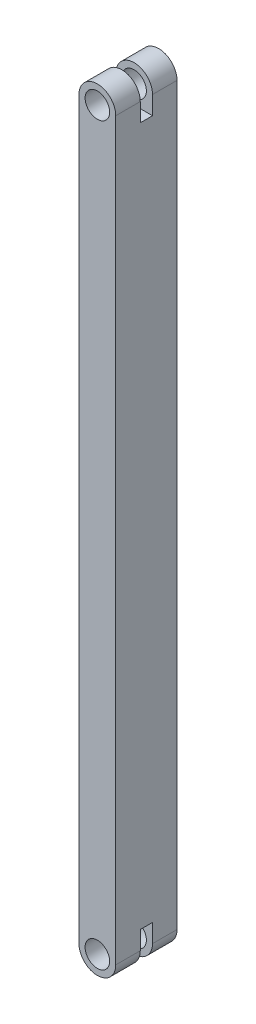
ISO-10303-21;
HEADER;
FILE_DESCRIPTION(('STEP AP214'),'2;1');
FILE_NAME('part.step','',(''),(''),'','','');
FILE_SCHEMA(('AUTOMOTIVE_DESIGN { 1 0 10303 214 1 1 1 1 }'));
ENDSEC;
DATA;
#1=APPLICATION_CONTEXT('core data for automotive mechanical design processes');
#2=APPLICATION_PROTOCOL_DEFINITION('international standard','automotive_design',2000,#1);
#3=PRODUCT_CONTEXT('',#1,'mechanical');
#4=PRODUCT('Part','Part','',(#3));
#5=PRODUCT_RELATED_PRODUCT_CATEGORY('part','',(#4));
#6=PRODUCT_DEFINITION_FORMATION('','',#4);
#7=PRODUCT_DEFINITION_CONTEXT('part definition',#1,'design');
#8=PRODUCT_DEFINITION('design','',#6,#7);
#9=PRODUCT_DEFINITION_SHAPE('','',#8);
#10=(LENGTH_UNIT() NAMED_UNIT(*) SI_UNIT(.MILLI.,.METRE.));
#11=(NAMED_UNIT(*) PLANE_ANGLE_UNIT() SI_UNIT($,.RADIAN.));
#12=(NAMED_UNIT(*) SI_UNIT($,.STERADIAN.) SOLID_ANGLE_UNIT());
#13=UNCERTAINTY_MEASURE_WITH_UNIT(LENGTH_MEASURE(1.E-05),#10,'distance_accuracy_value','');
#14=(GEOMETRIC_REPRESENTATION_CONTEXT(3) GLOBAL_UNCERTAINTY_ASSIGNED_CONTEXT((#13)) GLOBAL_UNIT_ASSIGNED_CONTEXT((#10,
#11,#12)) REPRESENTATION_CONTEXT('',''));
#15=CARTESIAN_POINT('',(0.,0.,0.));
#16=DIRECTION('',(0.,0.,1.));
#17=DIRECTION('',(1.,0.,0.));
#18=AXIS2_PLACEMENT_3D('',#15,#16,#17);
#19=CARTESIAN_POINT('',(0.,0.,25.));
#20=DIRECTION('',(0.,0.,-1.));
#21=DIRECTION('',(-1.,0.,0.));
#22=AXIS2_PLACEMENT_3D('',#19,#20,#21);
#23=CYLINDRICAL_SURFACE('',#22,7.5);
#24=DIRECTION('',(0.,0.,-1.));
#25=VECTOR('',#24,1.);
#26=CARTESIAN_POINT('',(7.5,0.,25.));
#27=LINE('',#26,#25);
#28=CARTESIAN_POINT('',(7.5,0.,9.99999999999997));
#29=VERTEX_POINT('',#28);
#30=CARTESIAN_POINT('',(7.5,0.,0.));
#31=VERTEX_POINT('',#30);
#32=EDGE_CURVE('E173',#29,#31,#27,.T.);
#33=ORIENTED_EDGE('',*,*,#32,.F.);
#34=CARTESIAN_POINT('',(0.,0.,9.99999999999997));
#35=DIRECTION('',(0.,0.,-1.));
#36=DIRECTION('',(-1.,0.,0.));
#37=AXIS2_PLACEMENT_3D('',#34,#35,#36);
#38=CIRCLE('',#37,7.5);
#39=CARTESIAN_POINT('',(-7.5,0.,9.99999999999997));
#40=VERTEX_POINT('',#39);
#41=EDGE_CURVE('E225',#29,#40,#38,.T.);
#42=ORIENTED_EDGE('',*,*,#41,.T.);
#43=DIRECTION('',(0.,0.,-1.));
#44=VECTOR('',#43,1.);
#45=CARTESIAN_POINT('',(-7.5,0.,25.));
#46=LINE('',#45,#44);
#47=CARTESIAN_POINT('',(-7.5,0.,0.));
#48=VERTEX_POINT('',#47);
#49=EDGE_CURVE('E273',#40,#48,#46,.T.);
#50=ORIENTED_EDGE('',*,*,#49,.T.);
#51=CARTESIAN_POINT('',(0.,0.,0.));
#52=DIRECTION('',(0.,0.,1.));
#53=DIRECTION('',(1.,0.,0.));
#54=AXIS2_PLACEMENT_3D('',#51,#52,#53);
#55=CIRCLE('',#54,7.5);
#56=EDGE_CURVE('E259',#48,#31,#55,.T.);
#57=ORIENTED_EDGE('',*,*,#56,.T.);
#58=EDGE_LOOP('',(#33,#42,#50,#57));
#59=FACE_BOUND('',#58,.T.);
#60=ADVANCED_FACE('F39',(#59),#23,.T.);
#61=CARTESIAN_POINT('',(0.,300.,25.));
#62=DIRECTION('',(0.,0.,-1.));
#63=DIRECTION('',(-1.,0.,0.));
#64=AXIS2_PLACEMENT_3D('',#61,#62,#63);
#65=CYLINDRICAL_SURFACE('',#64,7.5);
#66=DIRECTION('',(0.,0.,-1.));
#67=VECTOR('',#66,1.);
#68=CARTESIAN_POINT('',(7.5,300.,25.));
#69=LINE('',#68,#67);
#70=CARTESIAN_POINT('',(7.5,300.,25.));
#71=VERTEX_POINT('',#70);
#72=CARTESIAN_POINT('',(7.5,300.,15.));
#73=VERTEX_POINT('',#72);
#74=EDGE_CURVE('E165',#71,#73,#69,.T.);
#75=ORIENTED_EDGE('',*,*,#74,.T.);
#76=CARTESIAN_POINT('',(0.,300.,15.));
#77=DIRECTION('',(0.,0.,1.));
#78=DIRECTION('',(0.,-1.,0.));
#79=AXIS2_PLACEMENT_3D('',#76,#77,#78);
#80=CIRCLE('',#79,7.5);
#81=CARTESIAN_POINT('',(-7.5,300.,15.));
#82=VERTEX_POINT('',#81);
#83=EDGE_CURVE('E256',#73,#82,#80,.T.);
#84=ORIENTED_EDGE('',*,*,#83,.T.);
#85=DIRECTION('',(0.,0.,-1.));
#86=VECTOR('',#85,1.);
#87=CARTESIAN_POINT('',(-7.5,300.,25.));
#88=LINE('',#87,#86);
#89=CARTESIAN_POINT('',(-7.5,300.,25.));
#90=VERTEX_POINT('',#89);
#91=EDGE_CURVE('E154',#90,#82,#88,.T.);
#92=ORIENTED_EDGE('',*,*,#91,.F.);
#93=CARTESIAN_POINT('',(0.,300.,25.));
#94=DIRECTION('',(0.,0.,1.));
#95=DIRECTION('',(1.,0.,0.));
#96=AXIS2_PLACEMENT_3D('',#93,#94,#95);
#97=CIRCLE('',#96,7.5);
#98=EDGE_CURVE('E268',#71,#90,#97,.T.);
#99=ORIENTED_EDGE('',*,*,#98,.F.);
#100=EDGE_LOOP('',(#75,#84,#92,#99));
#101=FACE_BOUND('',#100,.T.);
#102=ADVANCED_FACE('F313',(#101),#65,.T.);
#103=CARTESIAN_POINT('',(-7.5,0.,25.));
#104=VERTEX_POINT('',#103);
#105=CARTESIAN_POINT('',(-7.5,0.,15.));
#106=VERTEX_POINT('',#105);
#107=EDGE_CURVE('E167',#104,#106,#46,.T.);
#108=ORIENTED_EDGE('',*,*,#107,.T.);
#109=CARTESIAN_POINT('',(0.,0.,15.));
#110=DIRECTION('',(0.,0.,1.));
#111=DIRECTION('',(1.,0.,0.));
#112=AXIS2_PLACEMENT_3D('',#109,#110,#111);
#113=CIRCLE('',#112,7.5);
#114=CARTESIAN_POINT('',(7.5,0.,15.));
#115=VERTEX_POINT('',#114);
#116=EDGE_CURVE('E250',#106,#115,#113,.T.);
#117=ORIENTED_EDGE('',*,*,#116,.T.);
#118=CARTESIAN_POINT('',(7.5,0.,25.));
#119=VERTEX_POINT('',#118);
#120=EDGE_CURVE('E174',#119,#115,#27,.T.);
#121=ORIENTED_EDGE('',*,*,#120,.F.);
#122=CARTESIAN_POINT('',(0.,0.,25.));
#123=DIRECTION('',(0.,0.,1.));
#124=DIRECTION('',(1.,0.,0.));
#125=AXIS2_PLACEMENT_3D('',#122,#123,#124);
#126=CIRCLE('',#125,7.5);
#127=EDGE_CURVE('E260',#104,#119,#126,.T.);
#128=ORIENTED_EDGE('',*,*,#127,.F.);
#129=EDGE_LOOP('',(#108,#117,#121,#128));
#130=FACE_BOUND('',#129,.T.);
#131=ADVANCED_FACE('F41',(#130),#23,.T.);
#132=CARTESIAN_POINT('',(7.5,0.,25.));
#133=DIRECTION('',(-1.,0.,0.));
#134=DIRECTION('',(0.,0.,1.));
#135=AXIS2_PLACEMENT_3D('',#132,#133,#134);
#136=PLANE('',#135);
#137=DIRECTION('',(0.,0.,-1.));
#138=VECTOR('',#137,1.);
#139=CARTESIAN_POINT('',(7.5,292.5,15.));
#140=LINE('',#139,#138);
#141=CARTESIAN_POINT('',(7.5,292.5,15.));
#142=VERTEX_POINT('',#141);
#143=CARTESIAN_POINT('',(7.5,292.5,10.));
#144=VERTEX_POINT('',#143);
#145=EDGE_CURVE('E217',#142,#144,#140,.T.);
#146=ORIENTED_EDGE('',*,*,#145,.F.);
#147=DIRECTION('',(0.,-1.,0.));
#148=VECTOR('',#147,1.);
#149=CARTESIAN_POINT('',(7.5,307.5,15.));
#150=LINE('',#149,#148);
#151=EDGE_CURVE('E137',#73,#142,#150,.T.);
#152=ORIENTED_EDGE('',*,*,#151,.F.);
#153=ORIENTED_EDGE('',*,*,#74,.F.);
#154=DIRECTION('',(0.,1.,0.));
#155=VECTOR('',#154,1.);
#156=CARTESIAN_POINT('',(7.5,0.,25.));
#157=LINE('',#156,#155);
#158=EDGE_CURVE('E264',#119,#71,#157,.T.);
#159=ORIENTED_EDGE('',*,*,#158,.F.);
#160=ORIENTED_EDGE('',*,*,#120,.T.);
#161=DIRECTION('',(0.,-1.,0.));
#162=VECTOR('',#161,1.);
#163=CARTESIAN_POINT('',(7.5,-7.5,15.));
#164=LINE('',#163,#162);
#165=CARTESIAN_POINT('',(7.5,7.5,15.));
#166=VERTEX_POINT('',#165);
#167=EDGE_CURVE('E211',#166,#115,#164,.T.);
#168=ORIENTED_EDGE('',*,*,#167,.F.);
#169=DIRECTION('',(0.,0.,1.));
#170=VECTOR('',#169,1.);
#171=CARTESIAN_POINT('',(7.5,7.5,15.));
#172=LINE('',#171,#170);
#173=CARTESIAN_POINT('',(7.5,7.5,9.99999999999997));
#174=VERTEX_POINT('',#173);
#175=EDGE_CURVE('E231',#174,#166,#172,.T.);
#176=ORIENTED_EDGE('',*,*,#175,.F.);
#177=DIRECTION('',(0.,1.,0.));
#178=VECTOR('',#177,1.);
#179=CARTESIAN_POINT('',(7.5,-7.5,9.99999999999997));
#180=LINE('',#179,#178);
#181=EDGE_CURVE('E238',#29,#174,#180,.T.);
#182=ORIENTED_EDGE('',*,*,#181,.F.);
#183=ORIENTED_EDGE('',*,*,#32,.T.);
#184=DIRECTION('',(0.,1.,0.));
#185=VECTOR('',#184,1.);
#186=CARTESIAN_POINT('',(7.5,0.,0.));
#187=LINE('',#186,#185);
#188=CARTESIAN_POINT('',(7.5,300.,0.));
#189=VERTEX_POINT('',#188);
#190=EDGE_CURVE('E277',#31,#189,#187,.T.);
#191=ORIENTED_EDGE('',*,*,#190,.T.);
#192=CARTESIAN_POINT('',(7.5,300.,10.));
#193=VERTEX_POINT('',#192);
#194=EDGE_CURVE('E160',#193,#189,#69,.T.);
#195=ORIENTED_EDGE('',*,*,#194,.F.);
#196=DIRECTION('',(0.,1.,0.));
#197=VECTOR('',#196,1.);
#198=CARTESIAN_POINT('',(7.5,307.5,10.));
#199=LINE('',#198,#197);
#200=EDGE_CURVE('E149',#144,#193,#199,.T.);
#201=ORIENTED_EDGE('',*,*,#200,.F.);
#202=EDGE_LOOP('',(#146,#152,#153,#159,#160,#168,#176,#182,#183,#191,#195,#201));
#203=FACE_BOUND('',#202,.T.);
#204=ADVANCED_FACE('F309',(#203),#136,.F.);
#205=CARTESIAN_POINT('',(0.,300.,10.));
#206=DIRECTION('',(0.,0.,-1.));
#207=DIRECTION('',(0.,1.,0.));
#208=AXIS2_PLACEMENT_3D('',#205,#206,#207);
#209=CIRCLE('',#208,7.5);
#210=CARTESIAN_POINT('',(-7.5,300.,10.));
#211=VERTEX_POINT('',#210);
#212=EDGE_CURVE('E253',#211,#193,#209,.T.);
#213=ORIENTED_EDGE('',*,*,#212,.T.);
#214=ORIENTED_EDGE('',*,*,#194,.T.);
#215=CARTESIAN_POINT('',(0.,300.,0.));
#216=DIRECTION('',(0.,0.,1.));
#217=DIRECTION('',(1.,0.,0.));
#218=AXIS2_PLACEMENT_3D('',#215,#216,#217);
#219=CIRCLE('',#218,7.5);
#220=CARTESIAN_POINT('',(-7.5,300.,0.));
#221=VERTEX_POINT('',#220);
#222=EDGE_CURVE('E281',#189,#221,#219,.T.);
#223=ORIENTED_EDGE('',*,*,#222,.T.);
#224=EDGE_CURVE('E161',#211,#221,#88,.T.);
#225=ORIENTED_EDGE('',*,*,#224,.F.);
#226=EDGE_LOOP('',(#213,#214,#223,#225));
#227=FACE_BOUND('',#226,.T.);
#228=ADVANCED_FACE('F318',(#227),#65,.T.);
#229=CARTESIAN_POINT('',(-7.5,0.,25.));
#230=DIRECTION('',(1.,0.,0.));
#231=DIRECTION('',(0.,0.,-1.));
#232=AXIS2_PLACEMENT_3D('',#229,#230,#231);
#233=PLANE('',#232);
#234=ORIENTED_EDGE('',*,*,#91,.T.);
#235=DIRECTION('',(0.,-1.,0.));
#236=VECTOR('',#235,1.);
#237=CARTESIAN_POINT('',(-7.5,0.,15.));
#238=LINE('',#237,#236);
#239=CARTESIAN_POINT('',(-7.5,292.5,15.));
#240=VERTEX_POINT('',#239);
#241=EDGE_CURVE('E11',#82,#240,#238,.T.);
#242=ORIENTED_EDGE('',*,*,#241,.T.);
#243=DIRECTION('',(0.,0.,-1.));
#244=VECTOR('',#243,1.);
#245=CARTESIAN_POINT('',(-7.5,292.5,15.));
#246=LINE('',#245,#244);
#247=CARTESIAN_POINT('',(-7.5,292.5,10.));
#248=VERTEX_POINT('',#247);
#249=EDGE_CURVE('E145',#240,#248,#246,.T.);
#250=ORIENTED_EDGE('',*,*,#249,.T.);
#251=DIRECTION('',(0.,1.,0.));
#252=VECTOR('',#251,1.);
#253=CARTESIAN_POINT('',(-7.5,307.5,10.));
#254=LINE('',#253,#252);
#255=EDGE_CURVE('E57',#248,#211,#254,.T.);
#256=ORIENTED_EDGE('',*,*,#255,.T.);
#257=ORIENTED_EDGE('',*,*,#224,.T.);
#258=DIRECTION('',(0.,-1.,0.));
#259=VECTOR('',#258,1.);
#260=CARTESIAN_POINT('',(-7.5,0.,0.));
#261=LINE('',#260,#259);
#262=EDGE_CURVE('E265',#221,#48,#261,.T.);
#263=ORIENTED_EDGE('',*,*,#262,.T.);
#264=ORIENTED_EDGE('',*,*,#49,.F.);
#265=DIRECTION('',(0.,1.,0.));
#266=VECTOR('',#265,1.);
#267=CARTESIAN_POINT('',(-7.5,0.,9.99999999999997));
#268=LINE('',#267,#266);
#269=CARTESIAN_POINT('',(-7.5,7.5,9.99999999999997));
#270=VERTEX_POINT('',#269);
#271=EDGE_CURVE('E49',#40,#270,#268,.T.);
#272=ORIENTED_EDGE('',*,*,#271,.T.);
#273=DIRECTION('',(0.,0.,1.));
#274=VECTOR('',#273,1.);
#275=CARTESIAN_POINT('',(-7.5,7.5,15.));
#276=LINE('',#275,#274);
#277=CARTESIAN_POINT('',(-7.5,7.5,15.));
#278=VERTEX_POINT('',#277);
#279=EDGE_CURVE('E65',#270,#278,#276,.T.);
#280=ORIENTED_EDGE('',*,*,#279,.T.);
#281=DIRECTION('',(0.,-1.,0.));
#282=VECTOR('',#281,1.);
#283=CARTESIAN_POINT('',(-7.5,-7.5,15.));
#284=LINE('',#283,#282);
#285=EDGE_CURVE('E227',#278,#106,#284,.T.);
#286=ORIENTED_EDGE('',*,*,#285,.T.);
#287=ORIENTED_EDGE('',*,*,#107,.F.);
#288=DIRECTION('',(0.,-1.,0.));
#289=VECTOR('',#288,1.);
#290=CARTESIAN_POINT('',(-7.5,0.,25.));
#291=LINE('',#290,#289);
#292=EDGE_CURVE('E156',#90,#104,#291,.T.);
#293=ORIENTED_EDGE('',*,*,#292,.F.);
#294=EDGE_LOOP('',(#234,#242,#250,#256,#257,#263,#264,#272,#280,#286,#287,#293));
#295=FACE_BOUND('',#294,.T.);
#296=ADVANCED_FACE('F151',(#295),#233,.F.);
#297=CARTESIAN_POINT('',(0.,0.,25.));
#298=DIRECTION('',(0.,0.,1.));
#299=DIRECTION('',(1.,0.,0.));
#300=AXIS2_PLACEMENT_3D('',#297,#298,#299);
#301=PLANE('',#300);
#302=CARTESIAN_POINT('',(0.,300.,25.));
#303=DIRECTION('',(0.,0.,1.));
#304=DIRECTION('',(1.,0.,0.));
#305=AXIS2_PLACEMENT_3D('',#302,#303,#304);
#306=CIRCLE('',#305,5.);
#307=CARTESIAN_POINT('',(5.,300.,25.));
#308=VERTEX_POINT('',#307);
#309=EDGE_CURVE('E192',#308,#308,#306,.T.);
#310=ORIENTED_EDGE('',*,*,#309,.F.);
#311=EDGE_LOOP('',(#310));
#312=FACE_BOUND('',#311,.T.);
#313=CARTESIAN_POINT('',(0.,0.,25.));
#314=DIRECTION('',(0.,0.,1.));
#315=DIRECTION('',(1.,0.,0.));
#316=AXIS2_PLACEMENT_3D('',#313,#314,#315);
#317=CIRCLE('',#316,5.);
#318=CARTESIAN_POINT('',(5.,0.,25.));
#319=VERTEX_POINT('',#318);
#320=EDGE_CURVE('E204',#319,#319,#317,.T.);
#321=ORIENTED_EDGE('',*,*,#320,.F.);
#322=EDGE_LOOP('',(#321));
#323=FACE_BOUND('',#322,.T.);
#324=ORIENTED_EDGE('',*,*,#127,.T.);
#325=ORIENTED_EDGE('',*,*,#158,.T.);
#326=ORIENTED_EDGE('',*,*,#98,.T.);
#327=ORIENTED_EDGE('',*,*,#292,.T.);
#328=EDGE_LOOP('',(#324,#325,#326,#327));
#329=FACE_BOUND('',#328,.T.);
#330=ADVANCED_FACE('F312',(#312,#323,#329),#301,.T.);
#331=CARTESIAN_POINT('',(0.,0.,0.));
#332=DIRECTION('',(0.,0.,1.));
#333=DIRECTION('',(1.,0.,0.));
#334=AXIS2_PLACEMENT_3D('',#331,#332,#333);
#335=PLANE('',#334);
#336=CARTESIAN_POINT('',(0.,300.,0.));
#337=DIRECTION('',(0.,0.,1.));
#338=DIRECTION('',(1.,0.,0.));
#339=AXIS2_PLACEMENT_3D('',#336,#337,#338);
#340=CIRCLE('',#339,5.);
#341=CARTESIAN_POINT('',(5.,300.,0.));
#342=VERTEX_POINT('',#341);
#343=EDGE_CURVE('E184',#342,#342,#340,.T.);
#344=ORIENTED_EDGE('',*,*,#343,.T.);
#345=EDGE_LOOP('',(#344));
#346=FACE_BOUND('',#345,.T.);
#347=CARTESIAN_POINT('',(0.,0.,0.));
#348=DIRECTION('',(0.,0.,1.));
#349=DIRECTION('',(1.,0.,0.));
#350=AXIS2_PLACEMENT_3D('',#347,#348,#349);
#351=CIRCLE('',#350,5.);
#352=CARTESIAN_POINT('',(5.,0.,0.));
#353=VERTEX_POINT('',#352);
#354=EDGE_CURVE('E198',#353,#353,#351,.T.);
#355=ORIENTED_EDGE('',*,*,#354,.T.);
#356=EDGE_LOOP('',(#355));
#357=FACE_BOUND('',#356,.T.);
#358=ORIENTED_EDGE('',*,*,#56,.F.);
#359=ORIENTED_EDGE('',*,*,#262,.F.);
#360=ORIENTED_EDGE('',*,*,#222,.F.);
#361=ORIENTED_EDGE('',*,*,#190,.F.);
#362=EDGE_LOOP('',(#358,#359,#360,#361));
#363=FACE_BOUND('',#362,.T.);
#364=ADVANCED_FACE('F293',(#346,#357,#363),#335,.F.);
#365=CARTESIAN_POINT('',(-7.5,-7.5,15.));
#366=DIRECTION('',(0.,0.,1.));
#367=DIRECTION('',(1.,0.,0.));
#368=AXIS2_PLACEMENT_3D('',#365,#366,#367);
#369=PLANE('',#368);
#370=CARTESIAN_POINT('',(0.,0.,15.));
#371=DIRECTION('',(0.,0.,1.));
#372=DIRECTION('',(1.,0.,0.));
#373=AXIS2_PLACEMENT_3D('',#370,#371,#372);
#374=CIRCLE('',#373,5.);
#375=CARTESIAN_POINT('',(5.,0.,15.));
#376=VERTEX_POINT('',#375);
#377=EDGE_CURVE('E208',#376,#376,#374,.T.);
#378=ORIENTED_EDGE('',*,*,#377,.T.);
#379=EDGE_LOOP('',(#378));
#380=FACE_BOUND('',#379,.T.);
#381=ORIENTED_EDGE('',*,*,#285,.F.);
#382=DIRECTION('',(1.,0.,0.));
#383=VECTOR('',#382,1.);
#384=CARTESIAN_POINT('',(-7.5,7.5,15.));
#385=LINE('',#384,#383);
#386=EDGE_CURVE('E218',#278,#166,#385,.T.);
#387=ORIENTED_EDGE('',*,*,#386,.T.);
#388=ORIENTED_EDGE('',*,*,#167,.T.);
#389=ORIENTED_EDGE('',*,*,#116,.F.);
#390=EDGE_LOOP('',(#381,#387,#388,#389));
#391=FACE_BOUND('',#390,.T.);
#392=ADVANCED_FACE('F305',(#380,#391),#369,.F.);
#393=CARTESIAN_POINT('',(-7.5,-7.5,9.99999999999997));
#394=DIRECTION('',(0.,0.,-1.));
#395=DIRECTION('',(-1.,0.,0.));
#396=AXIS2_PLACEMENT_3D('',#393,#394,#395);
#397=PLANE('',#396);
#398=CARTESIAN_POINT('',(0.,0.,9.99999999999997));
#399=DIRECTION('',(0.,0.,-1.));
#400=DIRECTION('',(-1.,0.,0.));
#401=AXIS2_PLACEMENT_3D('',#398,#399,#400);
#402=CIRCLE('',#401,5.);
#403=CARTESIAN_POINT('',(-5.,0.,9.99999999999997));
#404=VERTEX_POINT('',#403);
#405=EDGE_CURVE('E43',#404,#404,#402,.T.);
#406=ORIENTED_EDGE('',*,*,#405,.T.);
#407=EDGE_LOOP('',(#406));
#408=FACE_BOUND('',#407,.T.);
#409=ORIENTED_EDGE('',*,*,#181,.T.);
#410=DIRECTION('',(1.,0.,0.));
#411=VECTOR('',#410,1.);
#412=CARTESIAN_POINT('',(-7.5,7.5,9.99999999999997));
#413=LINE('',#412,#411);
#414=EDGE_CURVE('E234',#270,#174,#413,.T.);
#415=ORIENTED_EDGE('',*,*,#414,.F.);
#416=ORIENTED_EDGE('',*,*,#271,.F.);
#417=ORIENTED_EDGE('',*,*,#41,.F.);
#418=EDGE_LOOP('',(#409,#415,#416,#417));
#419=FACE_BOUND('',#418,.T.);
#420=ADVANCED_FACE('F322',(#408,#419),#397,.F.);
#421=CARTESIAN_POINT('',(-7.5,7.5,15.));
#422=DIRECTION('',(0.,1.,0.));
#423=DIRECTION('',(0.,0.,1.));
#424=AXIS2_PLACEMENT_3D('',#421,#422,#423);
#425=PLANE('',#424);
#426=ORIENTED_EDGE('',*,*,#175,.T.);
#427=ORIENTED_EDGE('',*,*,#386,.F.);
#428=ORIENTED_EDGE('',*,*,#279,.F.);
#429=ORIENTED_EDGE('',*,*,#414,.T.);
#430=EDGE_LOOP('',(#426,#427,#428,#429));
#431=FACE_BOUND('',#430,.T.);
#432=ADVANCED_FACE('F323',(#431),#425,.F.);
#433=CARTESIAN_POINT('',(-7.5,307.5,15.));
#434=DIRECTION('',(0.,0.,1.));
#435=DIRECTION('',(0.,-1.,0.));
#436=AXIS2_PLACEMENT_3D('',#433,#434,#435);
#437=PLANE('',#436);
#438=CARTESIAN_POINT('',(0.,300.,15.));
#439=DIRECTION('',(0.,0.,1.));
#440=DIRECTION('',(0.,-1.,0.));
#441=AXIS2_PLACEMENT_3D('',#438,#439,#440);
#442=CIRCLE('',#441,5.);
#443=CARTESIAN_POINT('',(0.,295.,15.));
#444=VERTEX_POINT('',#443);
#445=EDGE_CURVE('E183',#444,#444,#442,.T.);
#446=ORIENTED_EDGE('',*,*,#445,.T.);
#447=EDGE_LOOP('',(#446));
#448=FACE_BOUND('',#447,.T.);
#449=ORIENTED_EDGE('',*,*,#151,.T.);
#450=DIRECTION('',(1.,0.,0.));
#451=VECTOR('',#450,1.);
#452=CARTESIAN_POINT('',(-7.5,292.5,15.));
#453=LINE('',#452,#451);
#454=EDGE_CURVE('E132',#240,#142,#453,.T.);
#455=ORIENTED_EDGE('',*,*,#454,.F.);
#456=ORIENTED_EDGE('',*,*,#241,.F.);
#457=ORIENTED_EDGE('',*,*,#83,.F.);
#458=EDGE_LOOP('',(#449,#455,#456,#457));
#459=FACE_BOUND('',#458,.T.);
#460=ADVANCED_FACE('F134',(#448,#459),#437,.F.);
#461=CARTESIAN_POINT('',(-7.5,307.5,10.));
#462=DIRECTION('',(0.,0.,-1.));
#463=DIRECTION('',(0.,1.,0.));
#464=AXIS2_PLACEMENT_3D('',#461,#462,#463);
#465=PLANE('',#464);
#466=CARTESIAN_POINT('',(0.,300.,10.));
#467=DIRECTION('',(0.,0.,-1.));
#468=DIRECTION('',(0.,1.,0.));
#469=AXIS2_PLACEMENT_3D('',#466,#467,#468);
#470=CIRCLE('',#469,5.);
#471=CARTESIAN_POINT('',(0.,305.,10.));
#472=VERTEX_POINT('',#471);
#473=EDGE_CURVE('E180',#472,#472,#470,.T.);
#474=ORIENTED_EDGE('',*,*,#473,.T.);
#475=EDGE_LOOP('',(#474));
#476=FACE_BOUND('',#475,.T.);
#477=ORIENTED_EDGE('',*,*,#212,.F.);
#478=ORIENTED_EDGE('',*,*,#255,.F.);
#479=DIRECTION('',(1.,0.,0.));
#480=VECTOR('',#479,1.);
#481=CARTESIAN_POINT('',(-7.5,292.5,10.));
#482=LINE('',#481,#480);
#483=EDGE_CURVE('E142',#248,#144,#482,.T.);
#484=ORIENTED_EDGE('',*,*,#483,.T.);
#485=ORIENTED_EDGE('',*,*,#200,.T.);
#486=EDGE_LOOP('',(#477,#478,#484,#485));
#487=FACE_BOUND('',#486,.T.);
#488=ADVANCED_FACE('F316',(#476,#487),#465,.F.);
#489=CARTESIAN_POINT('',(-7.5,292.5,15.));
#490=DIRECTION('',(0.,-1.,0.));
#491=DIRECTION('',(0.,0.,-1.));
#492=AXIS2_PLACEMENT_3D('',#489,#490,#491);
#493=PLANE('',#492);
#494=ORIENTED_EDGE('',*,*,#145,.T.);
#495=ORIENTED_EDGE('',*,*,#483,.F.);
#496=ORIENTED_EDGE('',*,*,#249,.F.);
#497=ORIENTED_EDGE('',*,*,#454,.T.);
#498=EDGE_LOOP('',(#494,#495,#496,#497));
#499=FACE_BOUND('',#498,.T.);
#500=ADVANCED_FACE('F146',(#499),#493,.F.);
#501=CARTESIAN_POINT('',(0.,300.,0.));
#502=DIRECTION('',(0.,0.,1.));
#503=DIRECTION('',(1.,0.,0.));
#504=AXIS2_PLACEMENT_3D('',#501,#502,#503);
#505=CYLINDRICAL_SURFACE('',#504,5.);
#506=ORIENTED_EDGE('',*,*,#343,.F.);
#507=EDGE_LOOP('',(#506));
#508=FACE_BOUND('',#507,.T.);
#509=ORIENTED_EDGE('',*,*,#473,.F.);
#510=EDGE_LOOP('',(#509));
#511=FACE_BOUND('',#510,.T.);
#512=ADVANCED_FACE('F375',(#508,#511),#505,.F.);
#513=ORIENTED_EDGE('',*,*,#309,.T.);
#514=EDGE_LOOP('',(#513));
#515=FACE_BOUND('',#514,.T.);
#516=ORIENTED_EDGE('',*,*,#445,.F.);
#517=EDGE_LOOP('',(#516));
#518=FACE_BOUND('',#517,.T.);
#519=ADVANCED_FACE('F368',(#515,#518),#505,.F.);
#520=CARTESIAN_POINT('',(0.,0.,0.));
#521=DIRECTION('',(0.,0.,1.));
#522=DIRECTION('',(1.,0.,0.));
#523=AXIS2_PLACEMENT_3D('',#520,#521,#522);
#524=CYLINDRICAL_SURFACE('',#523,5.);
#525=ORIENTED_EDGE('',*,*,#354,.F.);
#526=EDGE_LOOP('',(#525));
#527=FACE_BOUND('',#526,.T.);
#528=ORIENTED_EDGE('',*,*,#405,.F.);
#529=EDGE_LOOP('',(#528));
#530=FACE_BOUND('',#529,.T.);
#531=ADVANCED_FACE('F362',(#527,#530),#524,.F.);
#532=ORIENTED_EDGE('',*,*,#320,.T.);
#533=EDGE_LOOP('',(#532));
#534=FACE_BOUND('',#533,.T.);
#535=ORIENTED_EDGE('',*,*,#377,.F.);
#536=EDGE_LOOP('',(#535));
#537=FACE_BOUND('',#536,.T.);
#538=ADVANCED_FACE('F360',(#534,#537),#524,.F.);
#539=CLOSED_SHELL('',(#60,#102,#131,#204,#228,#296,#330,#364,#392,#420,#432,#460,#488,#500,#512,
#519,#531,#538));
#540=MANIFOLD_SOLID_BREP('B2',#539);
#541=ADVANCED_BREP_SHAPE_REPRESENTATION('',(#18,#540),#14);
#542=SHAPE_DEFINITION_REPRESENTATION(#9,#541);
ENDSEC;
END-ISO-10303-21;
